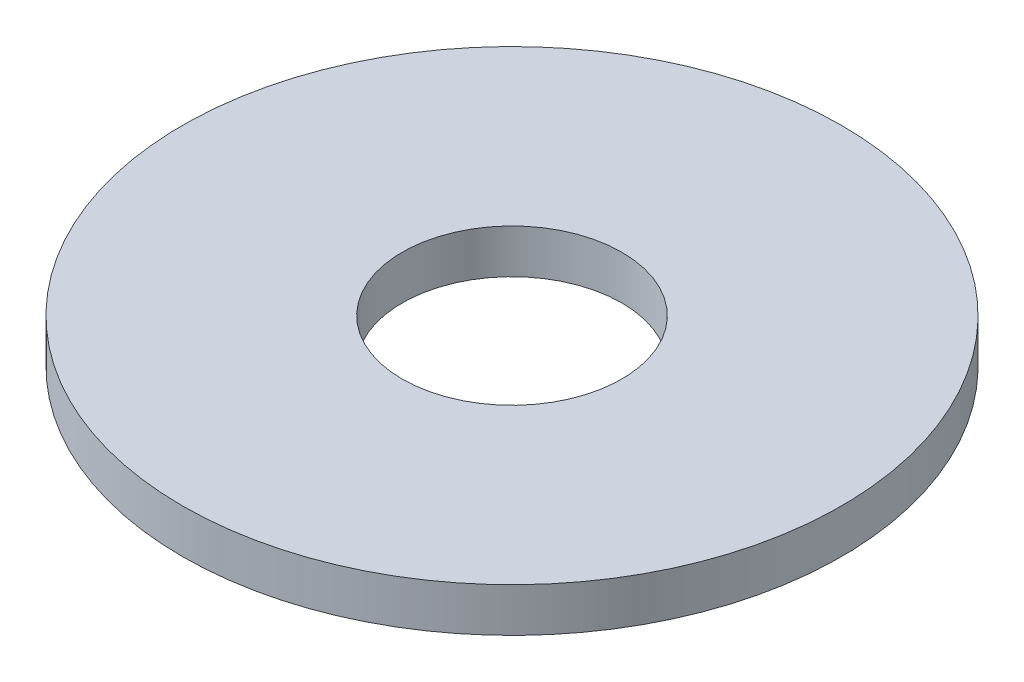
ISO-10303-21;
HEADER;
FILE_DESCRIPTION(('STEP AP214'),'2;1');
FILE_NAME('part.step','',(''),(''),'','','');
FILE_SCHEMA(('AUTOMOTIVE_DESIGN { 1 0 10303 214 1 1 1 1 }'));
ENDSEC;
DATA;
#1=APPLICATION_CONTEXT('core data for automotive mechanical design processes');
#2=APPLICATION_PROTOCOL_DEFINITION('international standard','automotive_design',2000,#1);
#3=PRODUCT_CONTEXT('',#1,'mechanical');
#4=PRODUCT('Part','Part','',(#3));
#5=PRODUCT_RELATED_PRODUCT_CATEGORY('part','',(#4));
#6=PRODUCT_DEFINITION_FORMATION('','',#4);
#7=PRODUCT_DEFINITION_CONTEXT('part definition',#1,'design');
#8=PRODUCT_DEFINITION('design','',#6,#7);
#9=PRODUCT_DEFINITION_SHAPE('','',#8);
#10=(LENGTH_UNIT() NAMED_UNIT(*) SI_UNIT(.MILLI.,.METRE.));
#11=(NAMED_UNIT(*) PLANE_ANGLE_UNIT() SI_UNIT($,.RADIAN.));
#12=(NAMED_UNIT(*) SI_UNIT($,.STERADIAN.) SOLID_ANGLE_UNIT());
#13=UNCERTAINTY_MEASURE_WITH_UNIT(LENGTH_MEASURE(1.E-05),#10,'distance_accuracy_value','');
#14=(GEOMETRIC_REPRESENTATION_CONTEXT(3) GLOBAL_UNCERTAINTY_ASSIGNED_CONTEXT((#13)) GLOBAL_UNIT_ASSIGNED_CONTEXT((#10,
#11,#12)) REPRESENTATION_CONTEXT('',''));
#15=CARTESIAN_POINT('',(0.,0.,0.));
#16=DIRECTION('',(0.,0.,1.));
#17=DIRECTION('',(1.,0.,0.));
#18=AXIS2_PLACEMENT_3D('',#15,#16,#17);
#19=CARTESIAN_POINT('',(69.5397809369922,2.,-133.635963101199));
#20=DIRECTION('',(0.,1.,0.));
#21=DIRECTION('',(0.,0.,1.));
#22=AXIS2_PLACEMENT_3D('',#19,#20,#21);
#23=PLANE('',#22);
#24=CARTESIAN_POINT('',(69.5397809369922,2.,-133.635963101199));
#25=DIRECTION('',(0.,1.,0.));
#26=DIRECTION('',(0.,0.,1.));
#27=AXIS2_PLACEMENT_3D('',#24,#25,#26);
#28=CIRCLE('',#27,15.);
#29=CARTESIAN_POINT('',(69.5397809369922,2.,-118.635963101199));
#30=VERTEX_POINT('',#29);
#31=EDGE_CURVE('E10',#30,#30,#28,.T.);
#32=ORIENTED_EDGE('',*,*,#31,.T.);
#33=EDGE_LOOP('',(#32));
#34=FACE_BOUND('',#33,.T.);
#35=CARTESIAN_POINT('',(69.5397809369922,2.,-133.635963101199));
#36=DIRECTION('',(0.,1.,0.));
#37=DIRECTION('',(0.,0.,1.));
#38=AXIS2_PLACEMENT_3D('',#35,#36,#37);
#39=CIRCLE('',#38,5.00000000000001);
#40=CARTESIAN_POINT('',(69.5397809369922,2.,-128.635963101199));
#41=VERTEX_POINT('',#40);
#42=EDGE_CURVE('E40',#41,#41,#39,.T.);
#43=ORIENTED_EDGE('',*,*,#42,.F.);
#44=EDGE_LOOP('',(#43));
#45=FACE_BOUND('',#44,.T.);
#46=ADVANCED_FACE('F29',(#34,#45),#23,.T.);
#47=CARTESIAN_POINT('',(69.5397809369922,0.,-133.635963101199));
#48=DIRECTION('',(0.,1.,0.));
#49=DIRECTION('',(0.,0.,1.));
#50=AXIS2_PLACEMENT_3D('',#47,#48,#49);
#51=PLANE('',#50);
#52=CARTESIAN_POINT('',(69.5397809369922,0.,-133.635963101199));
#53=DIRECTION('',(0.,1.,0.));
#54=DIRECTION('',(0.,0.,1.));
#55=AXIS2_PLACEMENT_3D('',#52,#53,#54);
#56=CIRCLE('',#55,15.);
#57=CARTESIAN_POINT('',(69.5397809369922,0.,-118.635963101199));
#58=VERTEX_POINT('',#57);
#59=EDGE_CURVE('E33',#58,#58,#56,.T.);
#60=ORIENTED_EDGE('',*,*,#59,.F.);
#61=EDGE_LOOP('',(#60));
#62=FACE_BOUND('',#61,.T.);
#63=CARTESIAN_POINT('',(69.5397809369922,0.,-133.635963101199));
#64=DIRECTION('',(0.,1.,0.));
#65=DIRECTION('',(0.,0.,1.));
#66=AXIS2_PLACEMENT_3D('',#63,#64,#65);
#67=CIRCLE('',#66,5.00000000000001);
#68=CARTESIAN_POINT('',(69.5397809369922,0.,-128.635963101199));
#69=VERTEX_POINT('',#68);
#70=EDGE_CURVE('E42',#69,#69,#67,.T.);
#71=ORIENTED_EDGE('',*,*,#70,.T.);
#72=EDGE_LOOP('',(#71));
#73=FACE_BOUND('',#72,.T.);
#74=ADVANCED_FACE('F52',(#62,#73),#51,.F.);
#75=CARTESIAN_POINT('',(69.5397809369922,2.,-133.635963101199));
#76=DIRECTION('',(0.,-1.,0.));
#77=DIRECTION('',(0.,0.,-1.));
#78=AXIS2_PLACEMENT_3D('',#75,#76,#77);
#79=CYLINDRICAL_SURFACE('',#78,15.);
#80=ORIENTED_EDGE('',*,*,#31,.F.);
#81=EDGE_LOOP('',(#80));
#82=FACE_BOUND('',#81,.T.);
#83=ORIENTED_EDGE('',*,*,#59,.T.);
#84=EDGE_LOOP('',(#83));
#85=FACE_BOUND('',#84,.T.);
#86=ADVANCED_FACE('F31',(#82,#85),#79,.T.);
#87=CARTESIAN_POINT('',(69.5397809369922,2.,-133.635963101199));
#88=DIRECTION('',(0.,-1.,0.));
#89=DIRECTION('',(0.,0.,-1.));
#90=AXIS2_PLACEMENT_3D('',#87,#88,#89);
#91=CYLINDRICAL_SURFACE('',#90,5.00000000000001);
#92=ORIENTED_EDGE('',*,*,#42,.T.);
#93=EDGE_LOOP('',(#92));
#94=FACE_BOUND('',#93,.T.);
#95=ORIENTED_EDGE('',*,*,#70,.F.);
#96=EDGE_LOOP('',(#95));
#97=FACE_BOUND('',#96,.T.);
#98=ADVANCED_FACE('F48',(#94,#97),#91,.F.);
#99=CLOSED_SHELL('',(#46,#74,#86,#98));
#100=MANIFOLD_SOLID_BREP('B2',#99);
#101=ADVANCED_BREP_SHAPE_REPRESENTATION('',(#18,#100),#14);
#102=SHAPE_DEFINITION_REPRESENTATION(#9,#101);
ENDSEC;
END-ISO-10303-21;
